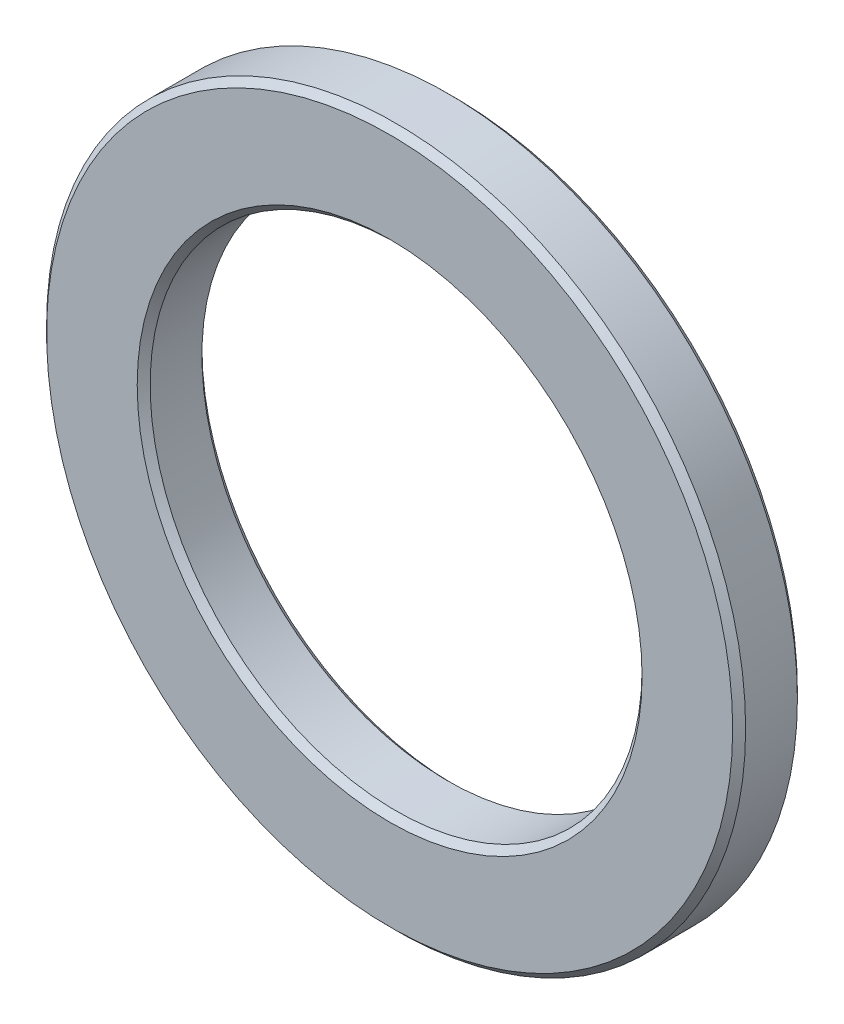
ISO-10303-21;
HEADER;
FILE_DESCRIPTION(('STEP AP214'),'2;1');
FILE_NAME('part.step','',(''),(''),'','','');
FILE_SCHEMA(('AUTOMOTIVE_DESIGN { 1 0 10303 214 1 1 1 1 }'));
ENDSEC;
DATA;
#1=APPLICATION_CONTEXT('core data for automotive mechanical design processes');
#2=APPLICATION_PROTOCOL_DEFINITION('international standard','automotive_design',2000,#1);
#3=PRODUCT_CONTEXT('',#1,'mechanical');
#4=PRODUCT('Part','Part','',(#3));
#5=PRODUCT_RELATED_PRODUCT_CATEGORY('part','',(#4));
#6=PRODUCT_DEFINITION_FORMATION('','',#4);
#7=PRODUCT_DEFINITION_CONTEXT('part definition',#1,'design');
#8=PRODUCT_DEFINITION('design','',#6,#7);
#9=PRODUCT_DEFINITION_SHAPE('','',#8);
#10=(LENGTH_UNIT() NAMED_UNIT(*) SI_UNIT(.MILLI.,.METRE.));
#11=(NAMED_UNIT(*) PLANE_ANGLE_UNIT() SI_UNIT($,.RADIAN.));
#12=(NAMED_UNIT(*) SI_UNIT($,.STERADIAN.) SOLID_ANGLE_UNIT());
#13=UNCERTAINTY_MEASURE_WITH_UNIT(LENGTH_MEASURE(1.E-05),#10,'distance_accuracy_value','');
#14=(GEOMETRIC_REPRESENTATION_CONTEXT(3) GLOBAL_UNCERTAINTY_ASSIGNED_CONTEXT((#13)) GLOBAL_UNIT_ASSIGNED_CONTEXT((#10,
#11,#12)) REPRESENTATION_CONTEXT('',''));
#15=CARTESIAN_POINT('',(0.,0.,0.));
#16=DIRECTION('',(0.,0.,1.));
#17=DIRECTION('',(1.,0.,0.));
#18=AXIS2_PLACEMENT_3D('',#15,#16,#17);
#19=CARTESIAN_POINT('',(0.,0.,2.5));
#20=DIRECTION('',(0.,0.,1.));
#21=DIRECTION('',(1.,0.,0.));
#22=AXIS2_PLACEMENT_3D('',#19,#20,#21);
#23=PLANE('',#22);
#24=CARTESIAN_POINT('',(0.,0.,2.5));
#25=DIRECTION('',(0.,0.,1.));
#26=DIRECTION('',(1.,0.,0.));
#27=AXIS2_PLACEMENT_3D('',#24,#25,#26);
#28=CIRCLE('',#27,26.5);
#29=CARTESIAN_POINT('',(26.5,0.,2.5));
#30=VERTEX_POINT('',#29);
#31=EDGE_CURVE('E10',#30,#30,#28,.T.);
#32=ORIENTED_EDGE('',*,*,#31,.T.);
#33=EDGE_LOOP('',(#32));
#34=FACE_BOUND('',#33,.T.);
#35=CARTESIAN_POINT('',(0.,0.,2.5));
#36=DIRECTION('',(0.,0.,1.));
#37=DIRECTION('',(1.,0.,0.));
#38=AXIS2_PLACEMENT_3D('',#35,#36,#37);
#39=CIRCLE('',#38,19.5);
#40=CARTESIAN_POINT('',(19.5,0.,2.5));
#41=VERTEX_POINT('',#40);
#42=EDGE_CURVE('E44',#41,#41,#39,.F.);
#43=ORIENTED_EDGE('',*,*,#42,.T.);
#44=EDGE_LOOP('',(#43));
#45=FACE_BOUND('',#44,.T.);
#46=ADVANCED_FACE('F36',(#34,#45),#23,.T.);
#47=CARTESIAN_POINT('',(0.,0.,-2.5));
#48=DIRECTION('',(0.,0.,1.));
#49=DIRECTION('',(1.,0.,0.));
#50=AXIS2_PLACEMENT_3D('',#47,#48,#49);
#51=PLANE('',#50);
#52=CARTESIAN_POINT('',(0.,0.,-2.5));
#53=DIRECTION('',(0.,0.,1.));
#54=DIRECTION('',(1.,0.,0.));
#55=AXIS2_PLACEMENT_3D('',#52,#53,#54);
#56=CIRCLE('',#55,19.5);
#57=CARTESIAN_POINT('',(19.5,0.,-2.5));
#58=VERTEX_POINT('',#57);
#59=EDGE_CURVE('E63',#58,#58,#56,.T.);
#60=ORIENTED_EDGE('',*,*,#59,.T.);
#61=EDGE_LOOP('',(#60));
#62=FACE_BOUND('',#61,.T.);
#63=CARTESIAN_POINT('',(0.,0.,-2.5));
#64=DIRECTION('',(0.,0.,1.));
#65=DIRECTION('',(1.,0.,0.));
#66=AXIS2_PLACEMENT_3D('',#63,#64,#65);
#67=CIRCLE('',#66,26.5);
#68=CARTESIAN_POINT('',(26.5,0.,-2.5));
#69=VERTEX_POINT('',#68);
#70=EDGE_CURVE('E66',#69,#69,#67,.F.);
#71=ORIENTED_EDGE('',*,*,#70,.T.);
#72=EDGE_LOOP('',(#71));
#73=FACE_BOUND('',#72,.T.);
#74=ADVANCED_FACE('F70',(#62,#73),#51,.F.);
#75=CARTESIAN_POINT('',(0.,0.,2.5));
#76=DIRECTION('',(0.,0.,-1.));
#77=DIRECTION('',(-1.,0.,0.));
#78=AXIS2_PLACEMENT_3D('',#75,#76,#77);
#79=CYLINDRICAL_SURFACE('',#78,27.);
#80=CARTESIAN_POINT('',(0.,0.,-1.99999999999999));
#81=DIRECTION('',(0.,0.,1.));
#82=DIRECTION('',(1.,0.,0.));
#83=AXIS2_PLACEMENT_3D('',#80,#81,#82);
#84=CIRCLE('',#83,27.);
#85=CARTESIAN_POINT('',(27.,0.,-1.99999999999999));
#86=VERTEX_POINT('',#85);
#87=EDGE_CURVE('E48',#86,#86,#84,.T.);
#88=ORIENTED_EDGE('',*,*,#87,.T.);
#89=EDGE_LOOP('',(#88));
#90=FACE_BOUND('',#89,.T.);
#91=CARTESIAN_POINT('',(0.,0.,1.99999999999999));
#92=DIRECTION('',(0.,0.,1.));
#93=DIRECTION('',(1.,0.,0.));
#94=AXIS2_PLACEMENT_3D('',#91,#92,#93);
#95=CIRCLE('',#94,27.);
#96=CARTESIAN_POINT('',(27.,0.,1.99999999999999));
#97=VERTEX_POINT('',#96);
#98=EDGE_CURVE('E52',#97,#97,#95,.F.);
#99=ORIENTED_EDGE('',*,*,#98,.T.);
#100=EDGE_LOOP('',(#99));
#101=FACE_BOUND('',#100,.T.);
#102=ADVANCED_FACE('F80',(#90,#101),#79,.T.);
#103=CARTESIAN_POINT('',(0.,0.,2.5));
#104=DIRECTION('',(0.,0.,-1.));
#105=DIRECTION('',(-1.,0.,0.));
#106=AXIS2_PLACEMENT_3D('',#103,#104,#105);
#107=CYLINDRICAL_SURFACE('',#106,19.);
#108=CARTESIAN_POINT('',(0.,0.,-1.99999999999999));
#109=DIRECTION('',(0.,0.,1.));
#110=DIRECTION('',(1.,0.,0.));
#111=AXIS2_PLACEMENT_3D('',#108,#109,#110);
#112=CIRCLE('',#111,19.);
#113=CARTESIAN_POINT('',(19.,0.,-1.99999999999999));
#114=VERTEX_POINT('',#113);
#115=EDGE_CURVE('E57',#114,#114,#112,.F.);
#116=ORIENTED_EDGE('',*,*,#115,.T.);
#117=EDGE_LOOP('',(#116));
#118=FACE_BOUND('',#117,.T.);
#119=CARTESIAN_POINT('',(0.,0.,2.));
#120=DIRECTION('',(0.,0.,1.));
#121=DIRECTION('',(1.,0.,0.));
#122=AXIS2_PLACEMENT_3D('',#119,#120,#121);
#123=CIRCLE('',#122,19.);
#124=CARTESIAN_POINT('',(19.,0.,2.));
#125=VERTEX_POINT('',#124);
#126=EDGE_CURVE('E60',#125,#125,#123,.T.);
#127=ORIENTED_EDGE('',*,*,#126,.T.);
#128=EDGE_LOOP('',(#127));
#129=FACE_BOUND('',#128,.T.);
#130=ADVANCED_FACE('F83',(#118,#129),#107,.F.);
#131=CARTESIAN_POINT('',(0.,0.,-2.5));
#132=DIRECTION('',(0.,0.,-1.));
#133=DIRECTION('',(-1.,0.,0.));
#134=AXIS2_PLACEMENT_3D('',#131,#132,#133);
#135=CONICAL_SURFACE('',#134,19.5,0.785398163397445);
#136=ORIENTED_EDGE('',*,*,#115,.F.);
#137=EDGE_LOOP('',(#136));
#138=FACE_BOUND('',#137,.T.);
#139=ORIENTED_EDGE('',*,*,#59,.F.);
#140=EDGE_LOOP('',(#139));
#141=FACE_BOUND('',#140,.T.);
#142=ADVANCED_FACE('F76',(#138,#141),#135,.F.);
#143=CARTESIAN_POINT('',(0.,0.,-1.99999999999999));
#144=DIRECTION('',(0.,0.,1.));
#145=DIRECTION('',(1.,0.,0.));
#146=AXIS2_PLACEMENT_3D('',#143,#144,#145);
#147=CONICAL_SURFACE('',#146,27.,0.785398163397448);
#148=ORIENTED_EDGE('',*,*,#70,.F.);
#149=EDGE_LOOP('',(#148));
#150=FACE_BOUND('',#149,.T.);
#151=ORIENTED_EDGE('',*,*,#87,.F.);
#152=EDGE_LOOP('',(#151));
#153=FACE_BOUND('',#152,.T.);
#154=ADVANCED_FACE('F72',(#150,#153),#147,.T.);
#155=CARTESIAN_POINT('',(0.,0.,2.5));
#156=DIRECTION('',(0.,0.,-1.));
#157=DIRECTION('',(-1.,0.,0.));
#158=AXIS2_PLACEMENT_3D('',#155,#156,#157);
#159=CONICAL_SURFACE('',#158,26.5,0.785398163397448);
#160=ORIENTED_EDGE('',*,*,#98,.F.);
#161=EDGE_LOOP('',(#160));
#162=FACE_BOUND('',#161,.T.);
#163=ORIENTED_EDGE('',*,*,#31,.F.);
#164=EDGE_LOOP('',(#163));
#165=FACE_BOUND('',#164,.T.);
#166=ADVANCED_FACE('F75',(#162,#165),#159,.T.);
#167=CARTESIAN_POINT('',(0.,0.,2.));
#168=DIRECTION('',(0.,0.,1.));
#169=DIRECTION('',(1.,0.,0.));
#170=AXIS2_PLACEMENT_3D('',#167,#168,#169);
#171=CONICAL_SURFACE('',#170,19.,0.785398163397445);
#172=ORIENTED_EDGE('',*,*,#42,.F.);
#173=EDGE_LOOP('',(#172));
#174=FACE_BOUND('',#173,.T.);
#175=ORIENTED_EDGE('',*,*,#126,.F.);
#176=EDGE_LOOP('',(#175));
#177=FACE_BOUND('',#176,.T.);
#178=ADVANCED_FACE('F39',(#174,#177),#171,.F.);
#179=CLOSED_SHELL('',(#46,#74,#102,#130,#142,#154,#166,#178));
#180=MANIFOLD_SOLID_BREP('B2',#179);
#181=ADVANCED_BREP_SHAPE_REPRESENTATION('',(#18,#180),#14);
#182=SHAPE_DEFINITION_REPRESENTATION(#9,#181);
ENDSEC;
END-ISO-10303-21;
